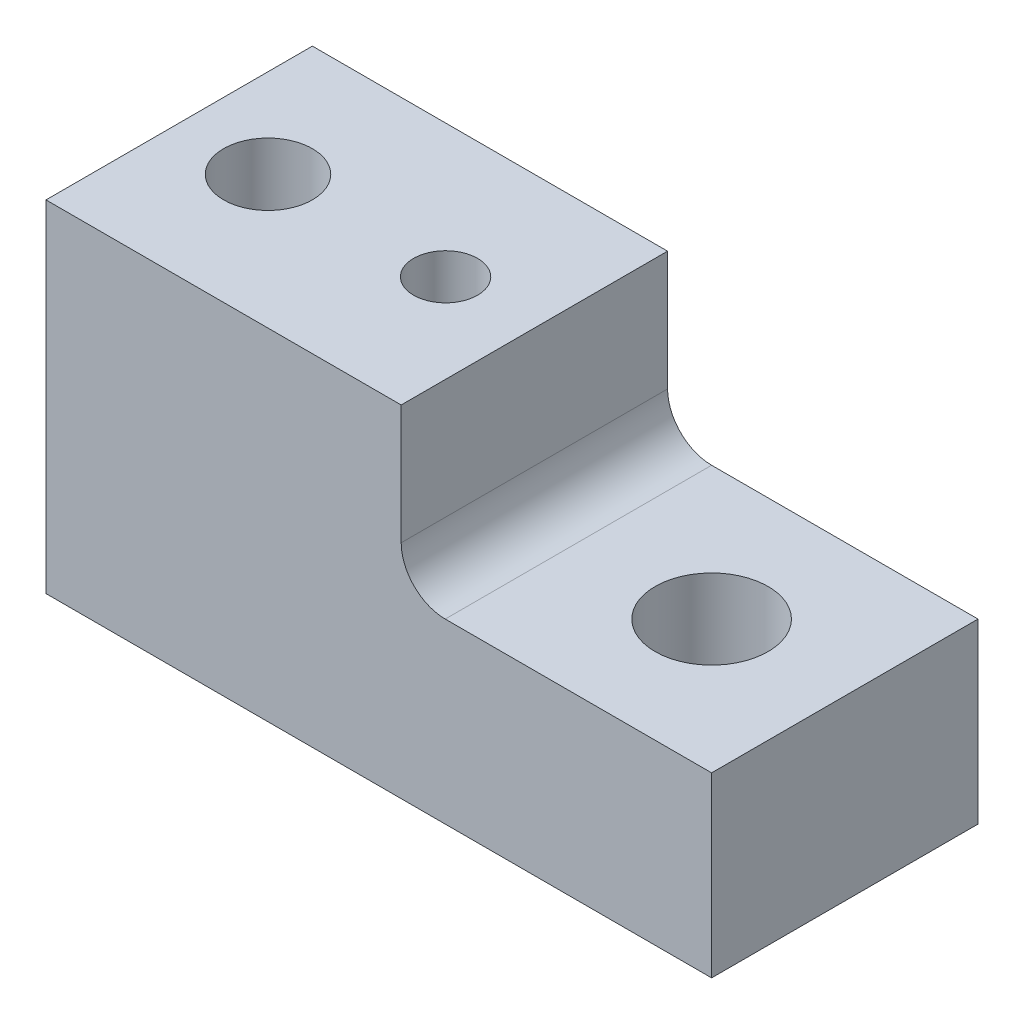
ISO-10303-21;
HEADER;
FILE_DESCRIPTION(('STEP AP214'),'2;1');
FILE_NAME('part.step','',(''),(''),'','','');
FILE_SCHEMA(('AUTOMOTIVE_DESIGN { 1 0 10303 214 1 1 1 1 }'));
ENDSEC;
DATA;
#1=APPLICATION_CONTEXT('core data for automotive mechanical design processes');
#2=APPLICATION_PROTOCOL_DEFINITION('international standard','automotive_design',2000,#1);
#3=PRODUCT_CONTEXT('',#1,'mechanical');
#4=PRODUCT('Part','Part','',(#3));
#5=PRODUCT_RELATED_PRODUCT_CATEGORY('part','',(#4));
#6=PRODUCT_DEFINITION_FORMATION('','',#4);
#7=PRODUCT_DEFINITION_CONTEXT('part definition',#1,'design');
#8=PRODUCT_DEFINITION('design','',#6,#7);
#9=PRODUCT_DEFINITION_SHAPE('','',#8);
#10=(LENGTH_UNIT() NAMED_UNIT(*) SI_UNIT(.MILLI.,.METRE.));
#11=(NAMED_UNIT(*) PLANE_ANGLE_UNIT() SI_UNIT($,.RADIAN.));
#12=(NAMED_UNIT(*) SI_UNIT($,.STERADIAN.) SOLID_ANGLE_UNIT());
#13=UNCERTAINTY_MEASURE_WITH_UNIT(LENGTH_MEASURE(1.E-05),#10,'distance_accuracy_value','');
#14=(GEOMETRIC_REPRESENTATION_CONTEXT(3) GLOBAL_UNCERTAINTY_ASSIGNED_CONTEXT((#13)) GLOBAL_UNIT_ASSIGNED_CONTEXT((#10,
#11,#12)) REPRESENTATION_CONTEXT('',''));
#15=CARTESIAN_POINT('',(0.,0.,0.));
#16=DIRECTION('',(0.,0.,1.));
#17=DIRECTION('',(1.,0.,0.));
#18=AXIS2_PLACEMENT_3D('',#15,#16,#17);
#19=CARTESIAN_POINT('',(11.8999,12.192,4.7625));
#20=DIRECTION('',(-1.,0.,0.));
#21=DIRECTION('',(0.,0.,1.));
#22=AXIS2_PLACEMENT_3D('',#19,#20,#21);
#23=PLANE('',#22);
#24=DIRECTION('',(0.,0.,-1.));
#25=VECTOR('',#24,1.);
#26=CARTESIAN_POINT('',(11.8999,6.35,4.7625));
#27=LINE('',#26,#25);
#28=CARTESIAN_POINT('',(11.8999,6.35,4.7625));
#29=VERTEX_POINT('',#28);
#30=CARTESIAN_POINT('',(11.8999,6.35,-4.7625));
#31=VERTEX_POINT('',#30);
#32=EDGE_CURVE('E91',#29,#31,#27,.T.);
#33=ORIENTED_EDGE('',*,*,#32,.F.);
#34=DIRECTION('',(0.,-1.,0.));
#35=VECTOR('',#34,1.);
#36=CARTESIAN_POINT('',(11.8999,12.192,4.7625));
#37=LINE('',#36,#35);
#38=CARTESIAN_POINT('',(11.8999,0.,4.7625));
#39=VERTEX_POINT('',#38);
#40=EDGE_CURVE('E113',#29,#39,#37,.T.);
#41=ORIENTED_EDGE('',*,*,#40,.T.);
#42=DIRECTION('',(0.,0.,-1.));
#43=VECTOR('',#42,1.);
#44=CARTESIAN_POINT('',(11.8999,0.,4.7625));
#45=LINE('',#44,#43);
#46=CARTESIAN_POINT('',(11.8999,0.,-4.7625));
#47=VERTEX_POINT('',#46);
#48=EDGE_CURVE('E111',#39,#47,#45,.T.);
#49=ORIENTED_EDGE('',*,*,#48,.T.);
#50=DIRECTION('',(0.,-1.,0.));
#51=VECTOR('',#50,1.);
#52=CARTESIAN_POINT('',(11.8999,12.192,-4.7625));
#53=LINE('',#52,#51);
#54=EDGE_CURVE('E106',#31,#47,#53,.T.);
#55=ORIENTED_EDGE('',*,*,#54,.F.);
#56=EDGE_LOOP('',(#33,#41,#49,#55));
#57=FACE_BOUND('',#56,.T.);
#58=ADVANCED_FACE('F34',(#57),#23,.F.);
#59=CARTESIAN_POINT('',(11.8999,12.192,4.7625));
#60=DIRECTION('',(0.,0.,-1.));
#61=DIRECTION('',(-1.,0.,0.));
#62=AXIS2_PLACEMENT_3D('',#59,#60,#61);
#63=PLANE('',#62);
#64=DIRECTION('',(1.,0.,0.));
#65=VECTOR('',#64,1.);
#66=CARTESIAN_POINT('',(11.8999,6.35,4.7625));
#67=LINE('',#66,#65);
#68=CARTESIAN_POINT('',(2.3749,6.35,4.7625));
#69=VERTEX_POINT('',#68);
#70=EDGE_CURVE('E97',#69,#29,#67,.T.);
#71=ORIENTED_EDGE('',*,*,#70,.F.);
#72=CARTESIAN_POINT('',(2.3749,7.9248,4.7625));
#73=DIRECTION('',(0.,0.,-1.));
#74=DIRECTION('',(-1.,0.,0.));
#75=AXIS2_PLACEMENT_3D('',#72,#73,#74);
#76=CIRCLE('',#75,1.5748);
#77=CARTESIAN_POINT('',(0.800100000000005,7.9248,4.7625));
#78=VERTEX_POINT('',#77);
#79=EDGE_CURVE('E42',#69,#78,#76,.T.);
#80=ORIENTED_EDGE('',*,*,#79,.T.);
#81=DIRECTION('',(0.,1.,0.));
#82=VECTOR('',#81,1.);
#83=CARTESIAN_POINT('',(0.800100000000005,6.35,4.7625));
#84=LINE('',#83,#82);
#85=CARTESIAN_POINT('',(0.800100000000005,12.192,4.7625));
#86=VERTEX_POINT('',#85);
#87=EDGE_CURVE('E129',#78,#86,#84,.T.);
#88=ORIENTED_EDGE('',*,*,#87,.T.);
#89=DIRECTION('',(1.,0.,0.));
#90=VECTOR('',#89,1.);
#91=CARTESIAN_POINT('',(11.8999,12.192,4.7625));
#92=LINE('',#91,#90);
#93=CARTESIAN_POINT('',(-11.8999,12.192,4.7625));
#94=VERTEX_POINT('',#93);
#95=EDGE_CURVE('E137',#94,#86,#92,.T.);
#96=ORIENTED_EDGE('',*,*,#95,.F.);
#97=DIRECTION('',(0.,-1.,0.));
#98=VECTOR('',#97,1.);
#99=CARTESIAN_POINT('',(-11.8999,12.192,4.7625));
#100=LINE('',#99,#98);
#101=CARTESIAN_POINT('',(-11.8999,0.,4.7625));
#102=VERTEX_POINT('',#101);
#103=EDGE_CURVE('E119',#94,#102,#100,.T.);
#104=ORIENTED_EDGE('',*,*,#103,.T.);
#105=DIRECTION('',(1.,0.,0.));
#106=VECTOR('',#105,1.);
#107=CARTESIAN_POINT('',(11.8999,0.,4.7625));
#108=LINE('',#107,#106);
#109=EDGE_CURVE('E135',#102,#39,#108,.T.);
#110=ORIENTED_EDGE('',*,*,#109,.T.);
#111=ORIENTED_EDGE('',*,*,#40,.F.);
#112=EDGE_LOOP('',(#71,#80,#88,#96,#104,#110,#111));
#113=FACE_BOUND('',#112,.T.);
#114=ADVANCED_FACE('F125',(#113),#63,.F.);
#115=CARTESIAN_POINT('',(11.8999,12.192,-4.7625));
#116=DIRECTION('',(0.,0.,1.));
#117=DIRECTION('',(1.,0.,0.));
#118=AXIS2_PLACEMENT_3D('',#115,#116,#117);
#119=PLANE('',#118);
#120=DIRECTION('',(-1.,0.,0.));
#121=VECTOR('',#120,1.);
#122=CARTESIAN_POINT('',(11.8999,12.192,-4.7625));
#123=LINE('',#122,#121);
#124=CARTESIAN_POINT('',(0.800100000000005,12.192,-4.7625));
#125=VERTEX_POINT('',#124);
#126=CARTESIAN_POINT('',(-11.8999,12.192,-4.7625));
#127=VERTEX_POINT('',#126);
#128=EDGE_CURVE('E140',#125,#127,#123,.T.);
#129=ORIENTED_EDGE('',*,*,#128,.F.);
#130=DIRECTION('',(0.,1.,0.));
#131=VECTOR('',#130,1.);
#132=CARTESIAN_POINT('',(0.800100000000005,6.35,-4.7625));
#133=LINE('',#132,#131);
#134=CARTESIAN_POINT('',(0.800100000000005,7.9248,-4.7625));
#135=VERTEX_POINT('',#134);
#136=EDGE_CURVE('E127',#135,#125,#133,.T.);
#137=ORIENTED_EDGE('',*,*,#136,.F.);
#138=CARTESIAN_POINT('',(2.3749,7.9248,-4.7625));
#139=DIRECTION('',(0.,0.,1.));
#140=DIRECTION('',(1.,0.,0.));
#141=AXIS2_PLACEMENT_3D('',#138,#139,#140);
#142=CIRCLE('',#141,1.5748);
#143=CARTESIAN_POINT('',(2.3749,6.35,-4.7625));
#144=VERTEX_POINT('',#143);
#145=EDGE_CURVE('E11',#135,#144,#142,.T.);
#146=ORIENTED_EDGE('',*,*,#145,.T.);
#147=DIRECTION('',(-1.,0.,0.));
#148=VECTOR('',#147,1.);
#149=CARTESIAN_POINT('',(11.8999,6.35,-4.7625));
#150=LINE('',#149,#148);
#151=EDGE_CURVE('E95',#31,#144,#150,.T.);
#152=ORIENTED_EDGE('',*,*,#151,.F.);
#153=ORIENTED_EDGE('',*,*,#54,.T.);
#154=DIRECTION('',(-1.,0.,0.));
#155=VECTOR('',#154,1.);
#156=CARTESIAN_POINT('',(11.8999,0.,-4.7625));
#157=LINE('',#156,#155);
#158=CARTESIAN_POINT('',(-11.8999,0.,-4.7625));
#159=VERTEX_POINT('',#158);
#160=EDGE_CURVE('E147',#47,#159,#157,.T.);
#161=ORIENTED_EDGE('',*,*,#160,.T.);
#162=DIRECTION('',(0.,-1.,0.));
#163=VECTOR('',#162,1.);
#164=CARTESIAN_POINT('',(-11.8999,12.192,-4.7625));
#165=LINE('',#164,#163);
#166=EDGE_CURVE('E114',#127,#159,#165,.T.);
#167=ORIENTED_EDGE('',*,*,#166,.F.);
#168=EDGE_LOOP('',(#129,#137,#146,#152,#153,#161,#167));
#169=FACE_BOUND('',#168,.T.);
#170=ADVANCED_FACE('F105',(#169),#119,.F.);
#171=CARTESIAN_POINT('',(-11.8999,12.192,4.7625));
#172=DIRECTION('',(1.,0.,0.));
#173=DIRECTION('',(0.,0.,-1.));
#174=AXIS2_PLACEMENT_3D('',#171,#172,#173);
#175=PLANE('',#174);
#176=DIRECTION('',(0.,0.,1.));
#177=VECTOR('',#176,1.);
#178=CARTESIAN_POINT('',(-11.8999,0.,4.7625));
#179=LINE('',#178,#177);
#180=EDGE_CURVE('E141',#159,#102,#179,.T.);
#181=ORIENTED_EDGE('',*,*,#180,.T.);
#182=ORIENTED_EDGE('',*,*,#103,.F.);
#183=DIRECTION('',(0.,0.,1.));
#184=VECTOR('',#183,1.);
#185=CARTESIAN_POINT('',(-11.8999,12.192,4.7625));
#186=LINE('',#185,#184);
#187=EDGE_CURVE('E143',#127,#94,#186,.T.);
#188=ORIENTED_EDGE('',*,*,#187,.F.);
#189=ORIENTED_EDGE('',*,*,#166,.T.);
#190=EDGE_LOOP('',(#181,#182,#188,#189));
#191=FACE_BOUND('',#190,.T.);
#192=ADVANCED_FACE('F159',(#191),#175,.F.);
#193=CARTESIAN_POINT('',(0.,12.192,0.));
#194=DIRECTION('',(0.,-1.,0.));
#195=DIRECTION('',(0.,0.,-1.));
#196=AXIS2_PLACEMENT_3D('',#193,#194,#195);
#197=PLANE('',#196);
#198=CARTESIAN_POINT('',(-8.7249,12.192,0.));
#199=DIRECTION('',(0.,1.,0.));
#200=DIRECTION('',(0.,0.,1.));
#201=AXIS2_PLACEMENT_3D('',#198,#199,#200);
#202=CIRCLE('',#201,1.5875);
#203=CARTESIAN_POINT('',(-8.7249,12.192,1.5875));
#204=VERTEX_POINT('',#203);
#205=EDGE_CURVE('E214',#204,#204,#202,.T.);
#206=ORIENTED_EDGE('',*,*,#205,.F.);
#207=EDGE_LOOP('',(#206));
#208=FACE_BOUND('',#207,.T.);
#209=CARTESIAN_POINT('',(-2.37489999999999,12.192,0.));
#210=DIRECTION('',(0.,1.,0.));
#211=DIRECTION('',(0.,0.,1.));
#212=AXIS2_PLACEMENT_3D('',#209,#210,#211);
#213=CIRCLE('',#212,1.143);
#214=CARTESIAN_POINT('',(-2.37489999999999,12.192,1.143));
#215=VERTEX_POINT('',#214);
#216=EDGE_CURVE('E209',#215,#215,#213,.T.);
#217=ORIENTED_EDGE('',*,*,#216,.F.);
#218=EDGE_LOOP('',(#217));
#219=FACE_BOUND('',#218,.T.);
#220=ORIENTED_EDGE('',*,*,#95,.T.);
#221=DIRECTION('',(0.,0.,1.));
#222=VECTOR('',#221,1.);
#223=CARTESIAN_POINT('',(0.800100000000005,12.192,4.7625));
#224=LINE('',#223,#222);
#225=EDGE_CURVE('E101',#125,#86,#224,.T.);
#226=ORIENTED_EDGE('',*,*,#225,.F.);
#227=ORIENTED_EDGE('',*,*,#128,.T.);
#228=ORIENTED_EDGE('',*,*,#187,.T.);
#229=EDGE_LOOP('',(#220,#226,#227,#228));
#230=FACE_BOUND('',#229,.T.);
#231=ADVANCED_FACE('F161',(#208,#219,#230),#197,.F.);
#232=CARTESIAN_POINT('',(0.,0.,0.));
#233=DIRECTION('',(0.,-1.,0.));
#234=DIRECTION('',(0.,0.,-1.));
#235=AXIS2_PLACEMENT_3D('',#232,#233,#234);
#236=PLANE('',#235);
#237=CARTESIAN_POINT('',(7.1374,0.,0.));
#238=DIRECTION('',(0.,1.,0.));
#239=DIRECTION('',(0.,0.,1.));
#240=AXIS2_PLACEMENT_3D('',#237,#238,#239);
#241=CIRCLE('',#240,2.0193);
#242=CARTESIAN_POINT('',(7.1374,0.,2.0193));
#243=VERTEX_POINT('',#242);
#244=EDGE_CURVE('E204',#243,#243,#241,.T.);
#245=ORIENTED_EDGE('',*,*,#244,.T.);
#246=EDGE_LOOP('',(#245));
#247=FACE_BOUND('',#246,.T.);
#248=CARTESIAN_POINT('',(-8.7249,0.,0.));
#249=DIRECTION('',(0.,1.,0.));
#250=DIRECTION('',(0.,0.,1.));
#251=AXIS2_PLACEMENT_3D('',#248,#249,#250);
#252=CIRCLE('',#251,1.5875);
#253=CARTESIAN_POINT('',(-8.7249,0.,1.5875));
#254=VERTEX_POINT('',#253);
#255=EDGE_CURVE('E134',#254,#254,#252,.T.);
#256=ORIENTED_EDGE('',*,*,#255,.T.);
#257=EDGE_LOOP('',(#256));
#258=FACE_BOUND('',#257,.T.);
#259=CARTESIAN_POINT('',(-2.37489999999999,0.,0.));
#260=DIRECTION('',(0.,1.,0.));
#261=DIRECTION('',(0.,0.,1.));
#262=AXIS2_PLACEMENT_3D('',#259,#260,#261);
#263=CIRCLE('',#262,1.143);
#264=CARTESIAN_POINT('',(-2.37489999999999,0.,1.143));
#265=VERTEX_POINT('',#264);
#266=EDGE_CURVE('E217',#265,#265,#263,.T.);
#267=ORIENTED_EDGE('',*,*,#266,.T.);
#268=EDGE_LOOP('',(#267));
#269=FACE_BOUND('',#268,.T.);
#270=ORIENTED_EDGE('',*,*,#109,.F.);
#271=ORIENTED_EDGE('',*,*,#180,.F.);
#272=ORIENTED_EDGE('',*,*,#160,.F.);
#273=ORIENTED_EDGE('',*,*,#48,.F.);
#274=EDGE_LOOP('',(#270,#271,#272,#273));
#275=FACE_BOUND('',#274,.T.);
#276=ADVANCED_FACE('F157',(#247,#258,#269,#275),#236,.T.);
#277=CARTESIAN_POINT('',(0.800100000000005,6.35,4.7625));
#278=DIRECTION('',(-1.,0.,0.));
#279=DIRECTION('',(0.,0.,1.));
#280=AXIS2_PLACEMENT_3D('',#277,#278,#279);
#281=PLANE('',#280);
#282=ORIENTED_EDGE('',*,*,#87,.F.);
#283=DIRECTION('',(0.,0.,1.));
#284=VECTOR('',#283,1.);
#285=CARTESIAN_POINT('',(0.800100000000005,7.9248,4.7625));
#286=LINE('',#285,#284);
#287=EDGE_CURVE('E49',#78,#135,#286,.F.);
#288=ORIENTED_EDGE('',*,*,#287,.T.);
#289=ORIENTED_EDGE('',*,*,#136,.T.);
#290=ORIENTED_EDGE('',*,*,#225,.T.);
#291=EDGE_LOOP('',(#282,#288,#289,#290));
#292=FACE_BOUND('',#291,.T.);
#293=ADVANCED_FACE('F172',(#292),#281,.F.);
#294=CARTESIAN_POINT('',(0.,6.35,0.));
#295=DIRECTION('',(0.,1.,0.));
#296=DIRECTION('',(0.,0.,1.));
#297=AXIS2_PLACEMENT_3D('',#294,#295,#296);
#298=PLANE('',#297);
#299=CARTESIAN_POINT('',(7.1374,6.35,0.));
#300=DIRECTION('',(0.,1.,0.));
#301=DIRECTION('',(0.,0.,1.));
#302=AXIS2_PLACEMENT_3D('',#299,#300,#301);
#303=CIRCLE('',#302,2.0193);
#304=CARTESIAN_POINT('',(7.1374,6.35,2.0193));
#305=VERTEX_POINT('',#304);
#306=EDGE_CURVE('E207',#305,#305,#303,.T.);
#307=ORIENTED_EDGE('',*,*,#306,.F.);
#308=EDGE_LOOP('',(#307));
#309=FACE_BOUND('',#308,.T.);
#310=ORIENTED_EDGE('',*,*,#151,.T.);
#311=DIRECTION('',(0.,0.,1.));
#312=VECTOR('',#311,1.);
#313=CARTESIAN_POINT('',(2.3749,6.35,0.));
#314=LINE('',#313,#312);
#315=EDGE_CURVE('E116',#144,#69,#314,.T.);
#316=ORIENTED_EDGE('',*,*,#315,.T.);
#317=ORIENTED_EDGE('',*,*,#70,.T.);
#318=ORIENTED_EDGE('',*,*,#32,.T.);
#319=EDGE_LOOP('',(#310,#316,#317,#318));
#320=FACE_BOUND('',#319,.T.);
#321=ADVANCED_FACE('F93',(#309,#320),#298,.T.);
#322=CARTESIAN_POINT('',(2.3749,7.9248,0.));
#323=DIRECTION('',(0.,0.,1.));
#324=DIRECTION('',(1.,0.,0.));
#325=AXIS2_PLACEMENT_3D('',#322,#323,#324);
#326=CYLINDRICAL_SURFACE('',#325,1.5748);
#327=ORIENTED_EDGE('',*,*,#145,.F.);
#328=ORIENTED_EDGE('',*,*,#287,.F.);
#329=ORIENTED_EDGE('',*,*,#79,.F.);
#330=ORIENTED_EDGE('',*,*,#315,.F.);
#331=EDGE_LOOP('',(#327,#328,#329,#330));
#332=FACE_BOUND('',#331,.T.);
#333=ADVANCED_FACE('F36',(#332),#326,.F.);
#334=CARTESIAN_POINT('',(-2.37489999999999,0.,0.));
#335=DIRECTION('',(0.,1.,0.));
#336=DIRECTION('',(0.,0.,1.));
#337=AXIS2_PLACEMENT_3D('',#334,#335,#336);
#338=CYLINDRICAL_SURFACE('',#337,1.143);
#339=CARTESIAN_POINT('',(-2.37489999999999,0.,1.143));
#340=CARTESIAN_POINT('',(-2.37489999999999,0.127,1.143));
#341=CARTESIAN_POINT('',(-2.37489999999999,0.254,1.143));
#342=CARTESIAN_POINT('',(-2.37489999999999,0.508,1.143));
#343=CARTESIAN_POINT('',(-2.37489999999999,0.635,1.143));
#344=CARTESIAN_POINT('',(-2.37489999999999,0.889,1.143));
#345=CARTESIAN_POINT('',(-2.37489999999999,1.016,1.143));
#346=CARTESIAN_POINT('',(-2.37489999999999,1.27,1.143));
#347=CARTESIAN_POINT('',(-2.37489999999999,1.397,1.143));
#348=CARTESIAN_POINT('',(-2.37489999999999,1.651,1.143));
#349=CARTESIAN_POINT('',(-2.37489999999999,1.778,1.143));
#350=CARTESIAN_POINT('',(-2.37489999999999,2.032,1.143));
#351=CARTESIAN_POINT('',(-2.37489999999999,2.159,1.143));
#352=CARTESIAN_POINT('',(-2.37489999999999,2.413,1.143));
#353=CARTESIAN_POINT('',(-2.37489999999999,2.54,1.143));
#354=CARTESIAN_POINT('',(-2.37489999999999,2.794,1.143));
#355=CARTESIAN_POINT('',(-2.37489999999999,2.921,1.143));
#356=CARTESIAN_POINT('',(-2.37489999999999,3.175,1.143));
#357=CARTESIAN_POINT('',(-2.37489999999999,3.302,1.143));
#358=CARTESIAN_POINT('',(-2.37489999999999,3.556,1.143));
#359=CARTESIAN_POINT('',(-2.37489999999999,3.683,1.143));
#360=CARTESIAN_POINT('',(-2.37489999999999,3.937,1.143));
#361=CARTESIAN_POINT('',(-2.37489999999999,4.064,1.143));
#362=CARTESIAN_POINT('',(-2.37489999999999,4.318,1.143));
#363=CARTESIAN_POINT('',(-2.37489999999999,4.445,1.143));
#364=CARTESIAN_POINT('',(-2.37489999999999,4.699,1.143));
#365=CARTESIAN_POINT('',(-2.37489999999999,4.826,1.143));
#366=CARTESIAN_POINT('',(-2.37489999999999,5.08,1.143));
#367=CARTESIAN_POINT('',(-2.37489999999999,5.207,1.143));
#368=CARTESIAN_POINT('',(-2.37489999999999,5.461,1.143));
#369=CARTESIAN_POINT('',(-2.37489999999999,5.588,1.143));
#370=CARTESIAN_POINT('',(-2.37489999999999,5.842,1.143));
#371=CARTESIAN_POINT('',(-2.37489999999999,5.969,1.143));
#372=CARTESIAN_POINT('',(-2.37489999999999,6.223,1.143));
#373=CARTESIAN_POINT('',(-2.37489999999999,6.35,1.143));
#374=CARTESIAN_POINT('',(-2.37489999999999,6.604,1.143));
#375=CARTESIAN_POINT('',(-2.37489999999999,6.731,1.143));
#376=CARTESIAN_POINT('',(-2.37489999999999,6.985,1.143));
#377=CARTESIAN_POINT('',(-2.37489999999999,7.112,1.143));
#378=CARTESIAN_POINT('',(-2.37489999999999,7.366,1.143));
#379=CARTESIAN_POINT('',(-2.37489999999999,7.493,1.143));
#380=CARTESIAN_POINT('',(-2.37489999999999,7.747,1.143));
#381=CARTESIAN_POINT('',(-2.37489999999999,7.874,1.143));
#382=CARTESIAN_POINT('',(-2.37489999999999,8.128,1.143));
#383=CARTESIAN_POINT('',(-2.37489999999999,8.255,1.143));
#384=CARTESIAN_POINT('',(-2.37489999999999,8.509,1.143));
#385=CARTESIAN_POINT('',(-2.37489999999999,8.636,1.143));
#386=CARTESIAN_POINT('',(-2.37489999999999,8.89,1.143));
#387=CARTESIAN_POINT('',(-2.37489999999999,9.017,1.143));
#388=CARTESIAN_POINT('',(-2.37489999999999,9.271,1.143));
#389=CARTESIAN_POINT('',(-2.37489999999999,9.398,1.143));
#390=CARTESIAN_POINT('',(-2.37489999999999,9.652,1.143));
#391=CARTESIAN_POINT('',(-2.37489999999999,9.779,1.143));
#392=CARTESIAN_POINT('',(-2.37489999999999,10.033,1.143));
#393=CARTESIAN_POINT('',(-2.37489999999999,10.16,1.143));
#394=CARTESIAN_POINT('',(-2.37489999999999,10.414,1.143));
#395=CARTESIAN_POINT('',(-2.37489999999999,10.541,1.143));
#396=CARTESIAN_POINT('',(-2.37489999999999,10.795,1.143));
#397=CARTESIAN_POINT('',(-2.37489999999999,10.922,1.143));
#398=CARTESIAN_POINT('',(-2.37489999999999,11.176,1.143));
#399=CARTESIAN_POINT('',(-2.37489999999999,11.303,1.143));
#400=CARTESIAN_POINT('',(-2.37489999999999,11.557,1.143));
#401=CARTESIAN_POINT('',(-2.37489999999999,11.684,1.143));
#402=CARTESIAN_POINT('',(-2.37489999999999,11.938,1.143));
#403=CARTESIAN_POINT('',(-2.37489999999999,12.065,1.143));
#404=CARTESIAN_POINT('',(-2.37489999999999,12.192,1.143));
#405=B_SPLINE_CURVE_WITH_KNOTS('',3,(#339,#340,#341,#342,#343,#344,#345,#346,#347,#348,#349,
#350,#351,#352,#353,#354,#355,#356,#357,#358,#359,#360,#361,#362,#363,#364,#365,#366,#367,#368,
#369,#370,#371,#372,#373,#374,#375,#376,#377,#378,#379,#380,#381,#382,#383,#384,#385,#386,#387,
#388,#389,#390,#391,#392,#393,#394,#395,#396,#397,#398,#399,#400,#401,#402,#403,#404),
.UNSPECIFIED.,.F.,.F.,(4,2,2,2,2,2,2,2,2,2,2,2,2,2,2,2,2,2,2,2,2,2,2,2,2,2,2,2,2,2,2,2,4),(0.,
0.381,0.762,1.143,1.524,1.905,2.286,2.667,3.048,3.429,3.81,4.191,4.572,4.953,5.334,5.715,6.096,
6.477,6.858,7.239,7.62,8.001,8.382,8.763,9.144,9.525,9.906,10.287,10.668,11.049,11.43,11.811,
12.192),.UNSPECIFIED.);
#406=EDGE_CURVE('BSEAM164',#265,#215,#405,.T.);
#407=ORIENTED_EDGE('',*,*,#266,.F.);
#408=ORIENTED_EDGE('',*,*,#216,.T.);
#409=ORIENTED_EDGE('',*,*,#406,.T.);
#410=ORIENTED_EDGE('',*,*,#406,.F.);
#411=EDGE_LOOP('',(#407,#409,#408,#410));
#412=FACE_BOUND('',#411,.T.);
#413=ADVANCED_FACE('F164',(#412),#338,.F.);
#414=CARTESIAN_POINT('',(-8.7249,0.,0.));
#415=DIRECTION('',(0.,1.,0.));
#416=DIRECTION('',(0.,0.,1.));
#417=AXIS2_PLACEMENT_3D('',#414,#415,#416);
#418=CYLINDRICAL_SURFACE('',#417,1.5875);
#419=CARTESIAN_POINT('',(-8.7249,0.,1.5875));
#420=CARTESIAN_POINT('',(-8.7249,0.127,1.5875));
#421=CARTESIAN_POINT('',(-8.7249,0.254,1.5875));
#422=CARTESIAN_POINT('',(-8.7249,0.508,1.5875));
#423=CARTESIAN_POINT('',(-8.7249,0.635,1.5875));
#424=CARTESIAN_POINT('',(-8.7249,0.889,1.5875));
#425=CARTESIAN_POINT('',(-8.7249,1.016,1.5875));
#426=CARTESIAN_POINT('',(-8.7249,1.27,1.5875));
#427=CARTESIAN_POINT('',(-8.7249,1.397,1.5875));
#428=CARTESIAN_POINT('',(-8.7249,1.651,1.5875));
#429=CARTESIAN_POINT('',(-8.7249,1.778,1.5875));
#430=CARTESIAN_POINT('',(-8.7249,2.032,1.5875));
#431=CARTESIAN_POINT('',(-8.7249,2.159,1.5875));
#432=CARTESIAN_POINT('',(-8.7249,2.413,1.5875));
#433=CARTESIAN_POINT('',(-8.7249,2.54,1.5875));
#434=CARTESIAN_POINT('',(-8.7249,2.794,1.5875));
#435=CARTESIAN_POINT('',(-8.7249,2.921,1.5875));
#436=CARTESIAN_POINT('',(-8.7249,3.175,1.5875));
#437=CARTESIAN_POINT('',(-8.7249,3.302,1.5875));
#438=CARTESIAN_POINT('',(-8.7249,3.556,1.5875));
#439=CARTESIAN_POINT('',(-8.7249,3.683,1.5875));
#440=CARTESIAN_POINT('',(-8.7249,3.937,1.5875));
#441=CARTESIAN_POINT('',(-8.7249,4.064,1.5875));
#442=CARTESIAN_POINT('',(-8.7249,4.318,1.5875));
#443=CARTESIAN_POINT('',(-8.7249,4.445,1.5875));
#444=CARTESIAN_POINT('',(-8.7249,4.699,1.5875));
#445=CARTESIAN_POINT('',(-8.7249,4.826,1.5875));
#446=CARTESIAN_POINT('',(-8.7249,5.08,1.5875));
#447=CARTESIAN_POINT('',(-8.7249,5.207,1.5875));
#448=CARTESIAN_POINT('',(-8.7249,5.461,1.5875));
#449=CARTESIAN_POINT('',(-8.7249,5.588,1.5875));
#450=CARTESIAN_POINT('',(-8.7249,5.842,1.5875));
#451=CARTESIAN_POINT('',(-8.7249,5.969,1.5875));
#452=CARTESIAN_POINT('',(-8.7249,6.223,1.5875));
#453=CARTESIAN_POINT('',(-8.7249,6.35,1.5875));
#454=CARTESIAN_POINT('',(-8.7249,6.604,1.5875));
#455=CARTESIAN_POINT('',(-8.7249,6.731,1.5875));
#456=CARTESIAN_POINT('',(-8.7249,6.985,1.5875));
#457=CARTESIAN_POINT('',(-8.7249,7.112,1.5875));
#458=CARTESIAN_POINT('',(-8.7249,7.366,1.5875));
#459=CARTESIAN_POINT('',(-8.7249,7.493,1.5875));
#460=CARTESIAN_POINT('',(-8.7249,7.747,1.5875));
#461=CARTESIAN_POINT('',(-8.7249,7.874,1.5875));
#462=CARTESIAN_POINT('',(-8.7249,8.128,1.5875));
#463=CARTESIAN_POINT('',(-8.7249,8.255,1.5875));
#464=CARTESIAN_POINT('',(-8.7249,8.509,1.5875));
#465=CARTESIAN_POINT('',(-8.7249,8.636,1.5875));
#466=CARTESIAN_POINT('',(-8.7249,8.89,1.5875));
#467=CARTESIAN_POINT('',(-8.7249,9.017,1.5875));
#468=CARTESIAN_POINT('',(-8.7249,9.271,1.5875));
#469=CARTESIAN_POINT('',(-8.7249,9.398,1.5875));
#470=CARTESIAN_POINT('',(-8.7249,9.652,1.5875));
#471=CARTESIAN_POINT('',(-8.7249,9.779,1.5875));
#472=CARTESIAN_POINT('',(-8.7249,10.033,1.5875));
#473=CARTESIAN_POINT('',(-8.7249,10.16,1.5875));
#474=CARTESIAN_POINT('',(-8.7249,10.414,1.5875));
#475=CARTESIAN_POINT('',(-8.7249,10.541,1.5875));
#476=CARTESIAN_POINT('',(-8.7249,10.795,1.5875));
#477=CARTESIAN_POINT('',(-8.7249,10.922,1.5875));
#478=CARTESIAN_POINT('',(-8.7249,11.176,1.5875));
#479=CARTESIAN_POINT('',(-8.7249,11.303,1.5875));
#480=CARTESIAN_POINT('',(-8.7249,11.557,1.5875));
#481=CARTESIAN_POINT('',(-8.7249,11.684,1.5875));
#482=CARTESIAN_POINT('',(-8.7249,11.938,1.5875));
#483=CARTESIAN_POINT('',(-8.7249,12.065,1.5875));
#484=CARTESIAN_POINT('',(-8.7249,12.192,1.5875));
#485=B_SPLINE_CURVE_WITH_KNOTS('',3,(#419,#420,#421,#422,#423,#424,#425,#426,#427,#428,#429,
#430,#431,#432,#433,#434,#435,#436,#437,#438,#439,#440,#441,#442,#443,#444,#445,#446,#447,#448,
#449,#450,#451,#452,#453,#454,#455,#456,#457,#458,#459,#460,#461,#462,#463,#464,#465,#466,#467,
#468,#469,#470,#471,#472,#473,#474,#475,#476,#477,#478,#479,#480,#481,#482,#483,#484),
.UNSPECIFIED.,.F.,.F.,(4,2,2,2,2,2,2,2,2,2,2,2,2,2,2,2,2,2,2,2,2,2,2,2,2,2,2,2,2,2,2,2,4),(0.,
0.381,0.762,1.143,1.524,1.905,2.286,2.667,3.048,3.429,3.81,4.191,4.572,4.953,5.334,5.715,6.096,
6.477,6.858,7.239,7.62,8.001,8.382,8.763,9.144,9.525,9.906,10.287,10.668,11.049,11.43,11.811,
12.192),.UNSPECIFIED.);
#486=EDGE_CURVE('BSEAM169',#254,#204,#485,.T.);
#487=ORIENTED_EDGE('',*,*,#255,.F.);
#488=ORIENTED_EDGE('',*,*,#205,.T.);
#489=ORIENTED_EDGE('',*,*,#486,.T.);
#490=ORIENTED_EDGE('',*,*,#486,.F.);
#491=EDGE_LOOP('',(#487,#489,#488,#490));
#492=FACE_BOUND('',#491,.T.);
#493=ADVANCED_FACE('F169',(#492),#418,.F.);
#494=CARTESIAN_POINT('',(7.1374,6.35,0.));
#495=DIRECTION('',(0.,1.,0.));
#496=DIRECTION('',(0.,0.,1.));
#497=AXIS2_PLACEMENT_3D('',#494,#495,#496);
#498=CYLINDRICAL_SURFACE('',#497,2.0193);
#499=ORIENTED_EDGE('',*,*,#244,.F.);
#500=EDGE_LOOP('',(#499));
#501=FACE_BOUND('',#500,.T.);
#502=ORIENTED_EDGE('',*,*,#306,.T.);
#503=EDGE_LOOP('',(#502));
#504=FACE_BOUND('',#503,.T.);
#505=ADVANCED_FACE('F195',(#501,#504),#498,.F.);
#506=CLOSED_SHELL('',(#58,#114,#170,#192,#231,#276,#293,#321,#333,#413,#493,#505));
#507=MANIFOLD_SOLID_BREP('B2',#506);
#508=ADVANCED_BREP_SHAPE_REPRESENTATION('',(#18,#507),#14);
#509=SHAPE_DEFINITION_REPRESENTATION(#9,#508);
ENDSEC;
END-ISO-10303-21;
